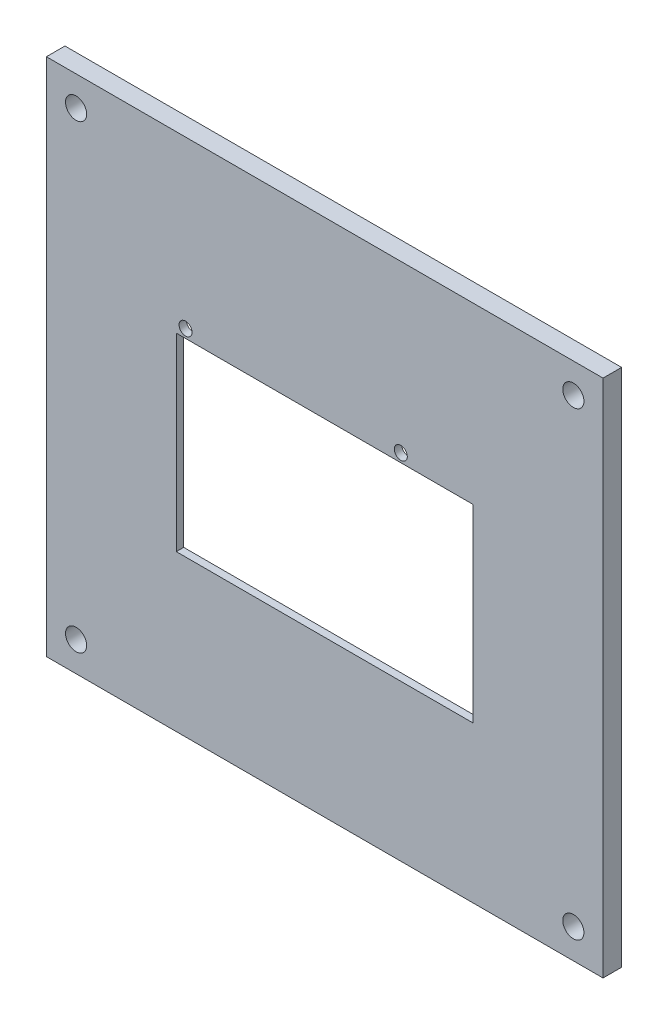
ISO-10303-21;
HEADER;
FILE_DESCRIPTION(('STEP AP214'),'2;1');
FILE_NAME('part.step','',(''),(''),'','','');
FILE_SCHEMA(('AUTOMOTIVE_DESIGN { 1 0 10303 214 1 1 1 1 }'));
ENDSEC;
DATA;
#1=APPLICATION_CONTEXT('core data for automotive mechanical design processes');
#2=APPLICATION_PROTOCOL_DEFINITION('international standard','automotive_design',2000,#1);
#3=PRODUCT_CONTEXT('',#1,'mechanical');
#4=PRODUCT('Part','Part','',(#3));
#5=PRODUCT_RELATED_PRODUCT_CATEGORY('part','',(#4));
#6=PRODUCT_DEFINITION_FORMATION('','',#4);
#7=PRODUCT_DEFINITION_CONTEXT('part definition',#1,'design');
#8=PRODUCT_DEFINITION('design','',#6,#7);
#9=PRODUCT_DEFINITION_SHAPE('','',#8);
#10=(LENGTH_UNIT() NAMED_UNIT(*) SI_UNIT(.MILLI.,.METRE.));
#11=(NAMED_UNIT(*) PLANE_ANGLE_UNIT() SI_UNIT($,.RADIAN.));
#12=(NAMED_UNIT(*) SI_UNIT($,.STERADIAN.) SOLID_ANGLE_UNIT());
#13=UNCERTAINTY_MEASURE_WITH_UNIT(LENGTH_MEASURE(1.E-05),#10,'distance_accuracy_value','');
#14=(GEOMETRIC_REPRESENTATION_CONTEXT(3) GLOBAL_UNCERTAINTY_ASSIGNED_CONTEXT((#13)) GLOBAL_UNIT_ASSIGNED_CONTEXT((#10,
#11,#12)) REPRESENTATION_CONTEXT('',''));
#15=CARTESIAN_POINT('',(0.,0.,0.));
#16=DIRECTION('',(0.,0.,1.));
#17=DIRECTION('',(1.,0.,0.));
#18=AXIS2_PLACEMENT_3D('',#15,#16,#17);
#19=CARTESIAN_POINT('',(0.,0.,5.));
#20=DIRECTION('',(0.,0.,1.));
#21=DIRECTION('',(1.,0.,0.));
#22=AXIS2_PLACEMENT_3D('',#19,#20,#21);
#23=PLANE('',#22);
#24=CARTESIAN_POINT('',(-34.421568627451,13.9638224034432,5.));
#25=DIRECTION('',(0.,0.,1.));
#26=DIRECTION('',(1.,0.,0.));
#27=AXIS2_PLACEMENT_3D('',#24,#25,#26);
#28=CIRCLE('',#27,1.75);
#29=CARTESIAN_POINT('',(-32.671568627451,13.9638224034432,5.));
#30=VERTEX_POINT('',#29);
#31=EDGE_CURVE('E331',#30,#30,#28,.T.);
#32=ORIENTED_EDGE('',*,*,#31,.F.);
#33=EDGE_LOOP('',(#32));
#34=FACE_BOUND('',#33,.T.);
#35=CARTESIAN_POINT('',(-63.921568627451,50.6638224034432,5.));
#36=DIRECTION('',(0.,0.,1.));
#37=DIRECTION('',(1.,0.,0.));
#38=AXIS2_PLACEMENT_3D('',#35,#36,#37);
#39=CIRCLE('',#38,2.84999999999999);
#40=CARTESIAN_POINT('',(-61.071568627451,50.6638224034432,5.));
#41=VERTEX_POINT('',#40);
#42=EDGE_CURVE('E157',#41,#41,#39,.T.);
#43=ORIENTED_EDGE('',*,*,#42,.F.);
#44=EDGE_LOOP('',(#43));
#45=FACE_BOUND('',#44,.T.);
#46=CARTESIAN_POINT('',(70.078431372549,-73.3361775965568,5.));
#47=DIRECTION('',(0.,0.,1.));
#48=DIRECTION('',(1.,0.,0.));
#49=AXIS2_PLACEMENT_3D('',#46,#47,#48);
#50=CIRCLE('',#49,2.85);
#51=CARTESIAN_POINT('',(72.928431372549,-73.3361775965568,5.));
#52=VERTEX_POINT('',#51);
#53=EDGE_CURVE('E169',#52,#52,#50,.T.);
#54=ORIENTED_EDGE('',*,*,#53,.F.);
#55=EDGE_LOOP('',(#54));
#56=FACE_BOUND('',#55,.T.);
#57=DIRECTION('',(0.,-1.,0.));
#58=VECTOR('',#57,1.);
#59=CARTESIAN_POINT('',(-71.921568627451,58.6638224034433,5.));
#60=LINE('',#59,#58);
#61=CARTESIAN_POINT('',(-71.921568627451,58.6638224034433,5.));
#62=VERTEX_POINT('',#61);
#63=CARTESIAN_POINT('',(-71.921568627451,-81.3361775965568,5.));
#64=VERTEX_POINT('',#63);
#65=EDGE_CURVE('E175',#62,#64,#60,.T.);
#66=ORIENTED_EDGE('',*,*,#65,.T.);
#67=DIRECTION('',(1.,0.,0.));
#68=VECTOR('',#67,1.);
#69=CARTESIAN_POINT('',(-71.921568627451,-81.3361775965568,5.));
#70=LINE('',#69,#68);
#71=CARTESIAN_POINT('',(78.078431372549,-81.3361775965568,5.));
#72=VERTEX_POINT('',#71);
#73=EDGE_CURVE('E178',#64,#72,#70,.T.);
#74=ORIENTED_EDGE('',*,*,#73,.T.);
#75=DIRECTION('',(0.,1.,0.));
#76=VECTOR('',#75,1.);
#77=CARTESIAN_POINT('',(78.078431372549,58.6638224034433,5.));
#78=LINE('',#77,#76);
#79=CARTESIAN_POINT('',(78.078431372549,58.6638224034433,5.));
#80=VERTEX_POINT('',#79);
#81=EDGE_CURVE('E181',#72,#80,#78,.T.);
#82=ORIENTED_EDGE('',*,*,#81,.T.);
#83=DIRECTION('',(-1.,0.,0.));
#84=VECTOR('',#83,1.);
#85=CARTESIAN_POINT('',(-71.921568627451,58.6638224034433,5.));
#86=LINE('',#85,#84);
#87=EDGE_CURVE('E183',#80,#62,#86,.T.);
#88=ORIENTED_EDGE('',*,*,#87,.T.);
#89=EDGE_LOOP('',(#66,#74,#82,#88));
#90=FACE_BOUND('',#89,.T.);
#91=CARTESIAN_POINT('',(-63.921568627451,-73.3361775965568,5.));
#92=DIRECTION('',(0.,0.,1.));
#93=DIRECTION('',(1.,0.,0.));
#94=AXIS2_PLACEMENT_3D('',#91,#92,#93);
#95=CIRCLE('',#94,2.85);
#96=CARTESIAN_POINT('',(-61.071568627451,-73.3361775965568,5.));
#97=VERTEX_POINT('',#96);
#98=EDGE_CURVE('E163',#97,#97,#95,.T.);
#99=ORIENTED_EDGE('',*,*,#98,.F.);
#100=EDGE_LOOP('',(#99));
#101=FACE_BOUND('',#100,.T.);
#102=CARTESIAN_POINT('',(70.078431372549,50.6638224034433,5.));
#103=DIRECTION('',(0.,0.,1.));
#104=DIRECTION('',(1.,0.,0.));
#105=AXIS2_PLACEMENT_3D('',#102,#103,#104);
#106=CIRCLE('',#105,2.85);
#107=CARTESIAN_POINT('',(72.928431372549,50.6638224034433,5.));
#108=VERTEX_POINT('',#107);
#109=EDGE_CURVE('E148',#108,#108,#106,.T.);
#110=ORIENTED_EDGE('',*,*,#109,.F.);
#111=EDGE_LOOP('',(#110));
#112=FACE_BOUND('',#111,.T.);
#113=DIRECTION('',(1.,0.,0.));
#114=VECTOR('',#113,1.);
#115=CARTESIAN_POINT('',(-36.921568627451,-39.3361775965568,5.));
#116=LINE('',#115,#114);
#117=CARTESIAN_POINT('',(-36.921568627451,-39.3361775965568,5.));
#118=VERTEX_POINT('',#117);
#119=CARTESIAN_POINT('',(43.078431372549,-39.3361775965568,5.));
#120=VERTEX_POINT('',#119);
#121=EDGE_CURVE('E335',#118,#120,#116,.T.);
#122=ORIENTED_EDGE('',*,*,#121,.F.);
#123=DIRECTION('',(0.,-1.,0.));
#124=VECTOR('',#123,1.);
#125=CARTESIAN_POINT('',(-36.921568627451,11.6638224034432,5.));
#126=LINE('',#125,#124);
#127=CARTESIAN_POINT('',(-36.921568627451,11.6638224034432,5.));
#128=VERTEX_POINT('',#127);
#129=EDGE_CURVE('E144',#128,#118,#126,.T.);
#130=ORIENTED_EDGE('',*,*,#129,.F.);
#131=DIRECTION('',(-1.,0.,0.));
#132=VECTOR('',#131,1.);
#133=CARTESIAN_POINT('',(-36.921568627451,11.6638224034432,5.));
#134=LINE('',#133,#132);
#135=CARTESIAN_POINT('',(43.078431372549,11.6638224034432,5.));
#136=VERTEX_POINT('',#135);
#137=EDGE_CURVE('E340',#136,#128,#134,.T.);
#138=ORIENTED_EDGE('',*,*,#137,.F.);
#139=DIRECTION('',(0.,1.,0.));
#140=VECTOR('',#139,1.);
#141=CARTESIAN_POINT('',(43.078431372549,11.6638224034432,5.));
#142=LINE('',#141,#140);
#143=EDGE_CURVE('E337',#120,#136,#142,.T.);
#144=ORIENTED_EDGE('',*,*,#143,.F.);
#145=EDGE_LOOP('',(#122,#130,#138,#144));
#146=FACE_BOUND('',#145,.T.);
#147=CARTESIAN_POINT('',(23.578431372549,13.9638224034432,5.));
#148=DIRECTION('',(0.,0.,1.));
#149=DIRECTION('',(1.,0.,0.));
#150=AXIS2_PLACEMENT_3D('',#147,#148,#149);
#151=CIRCLE('',#150,1.75);
#152=CARTESIAN_POINT('',(25.328431372549,13.9638224034432,5.));
#153=VERTEX_POINT('',#152);
#154=EDGE_CURVE('E313',#153,#153,#151,.T.);
#155=ORIENTED_EDGE('',*,*,#154,.F.);
#156=EDGE_LOOP('',(#155));
#157=FACE_BOUND('',#156,.T.);
#158=ADVANCED_FACE('F34',(#34,#45,#56,#90,#101,#112,#146,#157),#23,.T.);
#159=CARTESIAN_POINT('',(0.,0.,0.));
#160=DIRECTION('',(0.,0.,1.));
#161=DIRECTION('',(1.,0.,0.));
#162=AXIS2_PLACEMENT_3D('',#159,#160,#161);
#163=PLANE('',#162);
#164=DIRECTION('',(0.,-1.,0.));
#165=VECTOR('',#164,1.);
#166=CARTESIAN_POINT('',(53.078431372549,-49.3361775965568,0.));
#167=LINE('',#166,#165);
#168=CARTESIAN_POINT('',(53.078431372549,21.6638224034432,0.));
#169=VERTEX_POINT('',#168);
#170=CARTESIAN_POINT('',(53.078431372549,-49.3361775965568,0.));
#171=VERTEX_POINT('',#170);
#172=EDGE_CURVE('E361',#169,#171,#167,.T.);
#173=ORIENTED_EDGE('',*,*,#172,.F.);
#174=DIRECTION('',(1.,0.,0.));
#175=VECTOR('',#174,1.);
#176=CARTESIAN_POINT('',(53.078431372549,21.6638224034432,0.));
#177=LINE('',#176,#175);
#178=CARTESIAN_POINT('',(-46.921568627451,21.6638224034432,0.));
#179=VERTEX_POINT('',#178);
#180=EDGE_CURVE('E50',#179,#169,#177,.T.);
#181=ORIENTED_EDGE('',*,*,#180,.F.);
#182=DIRECTION('',(0.,1.,0.));
#183=VECTOR('',#182,1.);
#184=CARTESIAN_POINT('',(-46.921568627451,21.6638224034432,0.));
#185=LINE('',#184,#183);
#186=CARTESIAN_POINT('',(-46.921568627451,-49.3361775965568,0.));
#187=VERTEX_POINT('',#186);
#188=EDGE_CURVE('E322',#187,#179,#185,.T.);
#189=ORIENTED_EDGE('',*,*,#188,.F.);
#190=DIRECTION('',(-1.,0.,0.));
#191=VECTOR('',#190,1.);
#192=CARTESIAN_POINT('',(-46.921568627451,-49.3361775965568,0.));
#193=LINE('',#192,#191);
#194=EDGE_CURVE('E363',#171,#187,#193,.T.);
#195=ORIENTED_EDGE('',*,*,#194,.F.);
#196=EDGE_LOOP('',(#173,#181,#189,#195));
#197=FACE_BOUND('',#196,.T.);
#198=CARTESIAN_POINT('',(70.078431372549,50.6638224034433,0.));
#199=DIRECTION('',(0.,0.,1.));
#200=DIRECTION('',(1.,0.,0.));
#201=AXIS2_PLACEMENT_3D('',#198,#199,#200);
#202=CIRCLE('',#201,2.85);
#203=CARTESIAN_POINT('',(72.928431372549,50.6638224034433,0.));
#204=VERTEX_POINT('',#203);
#205=EDGE_CURVE('E145',#204,#204,#202,.T.);
#206=ORIENTED_EDGE('',*,*,#205,.T.);
#207=EDGE_LOOP('',(#206));
#208=FACE_BOUND('',#207,.T.);
#209=CARTESIAN_POINT('',(-63.921568627451,50.6638224034432,0.));
#210=DIRECTION('',(0.,0.,1.));
#211=DIRECTION('',(1.,0.,0.));
#212=AXIS2_PLACEMENT_3D('',#209,#210,#211);
#213=CIRCLE('',#212,2.84999999999999);
#214=CARTESIAN_POINT('',(-61.071568627451,50.6638224034432,0.));
#215=VERTEX_POINT('',#214);
#216=EDGE_CURVE('E155',#215,#215,#213,.T.);
#217=ORIENTED_EDGE('',*,*,#216,.T.);
#218=EDGE_LOOP('',(#217));
#219=FACE_BOUND('',#218,.T.);
#220=CARTESIAN_POINT('',(-63.921568627451,-73.3361775965568,0.));
#221=DIRECTION('',(0.,0.,1.));
#222=DIRECTION('',(1.,0.,0.));
#223=AXIS2_PLACEMENT_3D('',#220,#221,#222);
#224=CIRCLE('',#223,2.85);
#225=CARTESIAN_POINT('',(-61.071568627451,-73.3361775965568,0.));
#226=VERTEX_POINT('',#225);
#227=EDGE_CURVE('E160',#226,#226,#224,.T.);
#228=ORIENTED_EDGE('',*,*,#227,.T.);
#229=EDGE_LOOP('',(#228));
#230=FACE_BOUND('',#229,.T.);
#231=CARTESIAN_POINT('',(70.078431372549,-73.3361775965568,0.));
#232=DIRECTION('',(0.,0.,1.));
#233=DIRECTION('',(1.,0.,0.));
#234=AXIS2_PLACEMENT_3D('',#231,#232,#233);
#235=CIRCLE('',#234,2.85);
#236=CARTESIAN_POINT('',(72.928431372549,-73.3361775965568,0.));
#237=VERTEX_POINT('',#236);
#238=EDGE_CURVE('E166',#237,#237,#235,.T.);
#239=ORIENTED_EDGE('',*,*,#238,.T.);
#240=EDGE_LOOP('',(#239));
#241=FACE_BOUND('',#240,.T.);
#242=DIRECTION('',(0.,-1.,0.));
#243=VECTOR('',#242,1.);
#244=CARTESIAN_POINT('',(-71.921568627451,58.6638224034433,0.));
#245=LINE('',#244,#243);
#246=CARTESIAN_POINT('',(-71.921568627451,58.6638224034433,0.));
#247=VERTEX_POINT('',#246);
#248=CARTESIAN_POINT('',(-71.921568627451,-81.3361775965568,0.));
#249=VERTEX_POINT('',#248);
#250=EDGE_CURVE('E172',#247,#249,#245,.T.);
#251=ORIENTED_EDGE('',*,*,#250,.F.);
#252=DIRECTION('',(-1.,0.,0.));
#253=VECTOR('',#252,1.);
#254=CARTESIAN_POINT('',(-71.921568627451,58.6638224034433,0.));
#255=LINE('',#254,#253);
#256=CARTESIAN_POINT('',(78.078431372549,58.6638224034433,0.));
#257=VERTEX_POINT('',#256);
#258=EDGE_CURVE('E179',#257,#247,#255,.T.);
#259=ORIENTED_EDGE('',*,*,#258,.F.);
#260=DIRECTION('',(0.,1.,0.));
#261=VECTOR('',#260,1.);
#262=CARTESIAN_POINT('',(78.078431372549,58.6638224034433,0.));
#263=LINE('',#262,#261);
#264=CARTESIAN_POINT('',(78.078431372549,-81.3361775965568,0.));
#265=VERTEX_POINT('',#264);
#266=EDGE_CURVE('E190',#265,#257,#263,.T.);
#267=ORIENTED_EDGE('',*,*,#266,.F.);
#268=DIRECTION('',(1.,0.,0.));
#269=VECTOR('',#268,1.);
#270=CARTESIAN_POINT('',(-71.921568627451,-81.3361775965568,0.));
#271=LINE('',#270,#269);
#272=EDGE_CURVE('E188',#249,#265,#271,.T.);
#273=ORIENTED_EDGE('',*,*,#272,.F.);
#274=EDGE_LOOP('',(#251,#259,#267,#273));
#275=FACE_BOUND('',#274,.T.);
#276=ADVANCED_FACE('F209',(#197,#208,#219,#230,#241,#275),#163,.F.);
#277=CARTESIAN_POINT('',(-71.921568627451,58.6638224034433,5.));
#278=DIRECTION('',(1.,0.,0.));
#279=DIRECTION('',(0.,1.,0.));
#280=AXIS2_PLACEMENT_3D('',#277,#278,#279);
#281=PLANE('',#280);
#282=ORIENTED_EDGE('',*,*,#250,.T.);
#283=DIRECTION('',(0.,0.,-1.));
#284=VECTOR('',#283,1.);
#285=CARTESIAN_POINT('',(-71.921568627451,-81.3361775965568,5.));
#286=LINE('',#285,#284);
#287=EDGE_CURVE('E11',#64,#249,#286,.T.);
#288=ORIENTED_EDGE('',*,*,#287,.F.);
#289=ORIENTED_EDGE('',*,*,#65,.F.);
#290=DIRECTION('',(0.,0.,-1.));
#291=VECTOR('',#290,1.);
#292=CARTESIAN_POINT('',(-71.921568627451,58.6638224034433,5.));
#293=LINE('',#292,#291);
#294=EDGE_CURVE('E185',#62,#247,#293,.T.);
#295=ORIENTED_EDGE('',*,*,#294,.T.);
#296=EDGE_LOOP('',(#282,#288,#289,#295));
#297=FACE_BOUND('',#296,.T.);
#298=ADVANCED_FACE('F36',(#297),#281,.F.);
#299=CARTESIAN_POINT('',(-71.921568627451,-81.3361775965568,5.));
#300=DIRECTION('',(0.,1.,0.));
#301=DIRECTION('',(0.,0.,1.));
#302=AXIS2_PLACEMENT_3D('',#299,#300,#301);
#303=PLANE('',#302);
#304=ORIENTED_EDGE('',*,*,#272,.T.);
#305=DIRECTION('',(0.,0.,-1.));
#306=VECTOR('',#305,1.);
#307=CARTESIAN_POINT('',(78.078431372549,-81.3361775965568,5.));
#308=LINE('',#307,#306);
#309=EDGE_CURVE('E43',#72,#265,#308,.T.);
#310=ORIENTED_EDGE('',*,*,#309,.F.);
#311=ORIENTED_EDGE('',*,*,#73,.F.);
#312=ORIENTED_EDGE('',*,*,#287,.T.);
#313=EDGE_LOOP('',(#304,#310,#311,#312));
#314=FACE_BOUND('',#313,.T.);
#315=ADVANCED_FACE('F219',(#314),#303,.F.);
#316=CARTESIAN_POINT('',(78.078431372549,58.6638224034433,5.));
#317=DIRECTION('',(-1.,0.,0.));
#318=DIRECTION('',(0.,-1.,0.));
#319=AXIS2_PLACEMENT_3D('',#316,#317,#318);
#320=PLANE('',#319);
#321=ORIENTED_EDGE('',*,*,#266,.T.);
#322=DIRECTION('',(0.,0.,-1.));
#323=VECTOR('',#322,1.);
#324=CARTESIAN_POINT('',(78.078431372549,58.6638224034433,5.));
#325=LINE('',#324,#323);
#326=EDGE_CURVE('E195',#80,#257,#325,.T.);
#327=ORIENTED_EDGE('',*,*,#326,.F.);
#328=ORIENTED_EDGE('',*,*,#81,.F.);
#329=ORIENTED_EDGE('',*,*,#309,.T.);
#330=EDGE_LOOP('',(#321,#327,#328,#329));
#331=FACE_BOUND('',#330,.T.);
#332=ADVANCED_FACE('F203',(#331),#320,.F.);
#333=CARTESIAN_POINT('',(-71.921568627451,58.6638224034433,5.));
#334=DIRECTION('',(0.,-1.,0.));
#335=DIRECTION('',(0.,0.,-1.));
#336=AXIS2_PLACEMENT_3D('',#333,#334,#335);
#337=PLANE('',#336);
#338=ORIENTED_EDGE('',*,*,#258,.T.);
#339=ORIENTED_EDGE('',*,*,#294,.F.);
#340=ORIENTED_EDGE('',*,*,#87,.F.);
#341=ORIENTED_EDGE('',*,*,#326,.T.);
#342=EDGE_LOOP('',(#338,#339,#340,#341));
#343=FACE_BOUND('',#342,.T.);
#344=ADVANCED_FACE('F212',(#343),#337,.F.);
#345=CARTESIAN_POINT('',(70.078431372549,-73.3361775965568,5.));
#346=DIRECTION('',(0.,0.,-1.));
#347=DIRECTION('',(-1.,0.,0.));
#348=AXIS2_PLACEMENT_3D('',#345,#346,#347);
#349=CYLINDRICAL_SURFACE('',#348,2.85);
#350=ORIENTED_EDGE('',*,*,#53,.T.);
#351=EDGE_LOOP('',(#350));
#352=FACE_BOUND('',#351,.T.);
#353=ORIENTED_EDGE('',*,*,#238,.F.);
#354=EDGE_LOOP('',(#353));
#355=FACE_BOUND('',#354,.T.);
#356=ADVANCED_FACE('F237',(#352,#355),#349,.F.);
#357=CARTESIAN_POINT('',(-63.921568627451,-73.3361775965568,5.));
#358=DIRECTION('',(0.,0.,-1.));
#359=DIRECTION('',(-1.,0.,0.));
#360=AXIS2_PLACEMENT_3D('',#357,#358,#359);
#361=CYLINDRICAL_SURFACE('',#360,2.85);
#362=ORIENTED_EDGE('',*,*,#98,.T.);
#363=EDGE_LOOP('',(#362));
#364=FACE_BOUND('',#363,.T.);
#365=ORIENTED_EDGE('',*,*,#227,.F.);
#366=EDGE_LOOP('',(#365));
#367=FACE_BOUND('',#366,.T.);
#368=ADVANCED_FACE('F244',(#364,#367),#361,.F.);
#369=CARTESIAN_POINT('',(-63.921568627451,50.6638224034432,5.));
#370=DIRECTION('',(0.,0.,-1.));
#371=DIRECTION('',(-1.,0.,0.));
#372=AXIS2_PLACEMENT_3D('',#369,#370,#371);
#373=CYLINDRICAL_SURFACE('',#372,2.84999999999999);
#374=ORIENTED_EDGE('',*,*,#42,.T.);
#375=EDGE_LOOP('',(#374));
#376=FACE_BOUND('',#375,.T.);
#377=ORIENTED_EDGE('',*,*,#216,.F.);
#378=EDGE_LOOP('',(#377));
#379=FACE_BOUND('',#378,.T.);
#380=ADVANCED_FACE('F249',(#376,#379),#373,.F.);
#381=CARTESIAN_POINT('',(70.078431372549,50.6638224034433,5.));
#382=DIRECTION('',(0.,0.,-1.));
#383=DIRECTION('',(-1.,0.,0.));
#384=AXIS2_PLACEMENT_3D('',#381,#382,#383);
#385=CYLINDRICAL_SURFACE('',#384,2.85);
#386=ORIENTED_EDGE('',*,*,#109,.T.);
#387=EDGE_LOOP('',(#386));
#388=FACE_BOUND('',#387,.T.);
#389=ORIENTED_EDGE('',*,*,#205,.F.);
#390=EDGE_LOOP('',(#389));
#391=FACE_BOUND('',#390,.T.);
#392=ADVANCED_FACE('F259',(#388,#391),#385,.F.);
#393=CARTESIAN_POINT('',(-36.921568627451,11.6638224034432,5.));
#394=DIRECTION('',(1.,0.,0.));
#395=DIRECTION('',(0.,1.,0.));
#396=AXIS2_PLACEMENT_3D('',#393,#394,#395);
#397=PLANE('',#396);
#398=DIRECTION('',(0.,1.,0.));
#399=VECTOR('',#398,1.);
#400=CARTESIAN_POINT('',(-36.921568627451,11.6638224034432,3.));
#401=LINE('',#400,#399);
#402=CARTESIAN_POINT('',(-36.921568627451,-39.3361775965568,3.));
#403=VERTEX_POINT('',#402);
#404=CARTESIAN_POINT('',(-36.921568627451,11.6638224034432,3.));
#405=VERTEX_POINT('',#404);
#406=EDGE_CURVE('E122',#403,#405,#401,.T.);
#407=ORIENTED_EDGE('',*,*,#406,.T.);
#408=DIRECTION('',(0.,0.,-1.));
#409=VECTOR('',#408,1.);
#410=CARTESIAN_POINT('',(-36.921568627451,11.6638224034432,5.));
#411=LINE('',#410,#409);
#412=EDGE_CURVE('E342',#128,#405,#411,.T.);
#413=ORIENTED_EDGE('',*,*,#412,.F.);
#414=ORIENTED_EDGE('',*,*,#129,.T.);
#415=DIRECTION('',(0.,0.,-1.));
#416=VECTOR('',#415,1.);
#417=CARTESIAN_POINT('',(-36.921568627451,-39.3361775965568,5.));
#418=LINE('',#417,#416);
#419=EDGE_CURVE('E137',#118,#403,#418,.T.);
#420=ORIENTED_EDGE('',*,*,#419,.T.);
#421=EDGE_LOOP('',(#407,#413,#414,#420));
#422=FACE_BOUND('',#421,.T.);
#423=ADVANCED_FACE('F142',(#422),#397,.T.);
#424=CARTESIAN_POINT('',(-36.921568627451,-39.3361775965568,5.));
#425=DIRECTION('',(0.,1.,0.));
#426=DIRECTION('',(0.,0.,1.));
#427=AXIS2_PLACEMENT_3D('',#424,#425,#426);
#428=PLANE('',#427);
#429=DIRECTION('',(-1.,0.,0.));
#430=VECTOR('',#429,1.);
#431=CARTESIAN_POINT('',(-36.921568627451,-39.3361775965568,3.));
#432=LINE('',#431,#430);
#433=CARTESIAN_POINT('',(43.078431372549,-39.3361775965568,3.));
#434=VERTEX_POINT('',#433);
#435=EDGE_CURVE('E126',#434,#403,#432,.T.);
#436=ORIENTED_EDGE('',*,*,#435,.T.);
#437=ORIENTED_EDGE('',*,*,#419,.F.);
#438=ORIENTED_EDGE('',*,*,#121,.T.);
#439=DIRECTION('',(0.,0.,-1.));
#440=VECTOR('',#439,1.);
#441=CARTESIAN_POINT('',(43.078431372549,-39.3361775965568,5.));
#442=LINE('',#441,#440);
#443=EDGE_CURVE('E140',#120,#434,#442,.T.);
#444=ORIENTED_EDGE('',*,*,#443,.T.);
#445=EDGE_LOOP('',(#436,#437,#438,#444));
#446=FACE_BOUND('',#445,.T.);
#447=ADVANCED_FACE('F136',(#446),#428,.T.);
#448=CARTESIAN_POINT('',(43.078431372549,11.6638224034432,5.));
#449=DIRECTION('',(-1.,0.,0.));
#450=DIRECTION('',(0.,-1.,0.));
#451=AXIS2_PLACEMENT_3D('',#448,#449,#450);
#452=PLANE('',#451);
#453=DIRECTION('',(0.,-1.,0.));
#454=VECTOR('',#453,1.);
#455=CARTESIAN_POINT('',(43.078431372549,-39.3361775965568,3.));
#456=LINE('',#455,#454);
#457=CARTESIAN_POINT('',(43.078431372549,11.6638224034432,3.));
#458=VERTEX_POINT('',#457);
#459=EDGE_CURVE('E58',#458,#434,#456,.T.);
#460=ORIENTED_EDGE('',*,*,#459,.T.);
#461=ORIENTED_EDGE('',*,*,#443,.F.);
#462=ORIENTED_EDGE('',*,*,#143,.T.);
#463=DIRECTION('',(0.,0.,-1.));
#464=VECTOR('',#463,1.);
#465=CARTESIAN_POINT('',(43.078431372549,11.6638224034432,5.));
#466=LINE('',#465,#464);
#467=EDGE_CURVE('E150',#136,#458,#466,.T.);
#468=ORIENTED_EDGE('',*,*,#467,.T.);
#469=EDGE_LOOP('',(#460,#461,#462,#468));
#470=FACE_BOUND('',#469,.T.);
#471=ADVANCED_FACE('F271',(#470),#452,.T.);
#472=CARTESIAN_POINT('',(-36.921568627451,11.6638224034432,5.));
#473=DIRECTION('',(0.,-1.,0.));
#474=DIRECTION('',(0.,0.,-1.));
#475=AXIS2_PLACEMENT_3D('',#472,#473,#474);
#476=PLANE('',#475);
#477=DIRECTION('',(1.,0.,0.));
#478=VECTOR('',#477,1.);
#479=CARTESIAN_POINT('',(43.078431372549,11.6638224034432,3.));
#480=LINE('',#479,#478);
#481=EDGE_CURVE('E127',#405,#458,#480,.T.);
#482=ORIENTED_EDGE('',*,*,#481,.T.);
#483=ORIENTED_EDGE('',*,*,#467,.F.);
#484=ORIENTED_EDGE('',*,*,#137,.T.);
#485=ORIENTED_EDGE('',*,*,#412,.T.);
#486=EDGE_LOOP('',(#482,#483,#484,#485));
#487=FACE_BOUND('',#486,.T.);
#488=ADVANCED_FACE('F274',(#487),#476,.T.);
#489=CARTESIAN_POINT('',(-34.421568627451,13.9638224034432,5.));
#490=DIRECTION('',(0.,0.,-1.));
#491=DIRECTION('',(-1.,0.,0.));
#492=AXIS2_PLACEMENT_3D('',#489,#490,#491);
#493=CYLINDRICAL_SURFACE('',#492,1.75);
#494=CARTESIAN_POINT('',(-34.421568627451,13.9638224034432,3.));
#495=DIRECTION('',(0.,0.,1.));
#496=DIRECTION('',(1.,0.,0.));
#497=AXIS2_PLACEMENT_3D('',#494,#495,#496);
#498=CIRCLE('',#497,1.75);
#499=CARTESIAN_POINT('',(-32.671568627451,13.9638224034432,3.));
#500=VERTEX_POINT('',#499);
#501=EDGE_CURVE('E309',#500,#500,#498,.T.);
#502=ORIENTED_EDGE('',*,*,#501,.F.);
#503=EDGE_LOOP('',(#502));
#504=FACE_BOUND('',#503,.T.);
#505=ORIENTED_EDGE('',*,*,#31,.T.);
#506=EDGE_LOOP('',(#505));
#507=FACE_BOUND('',#506,.T.);
#508=ADVANCED_FACE('F278',(#504,#507),#493,.F.);
#509=CARTESIAN_POINT('',(23.578431372549,13.9638224034432,5.));
#510=DIRECTION('',(0.,0.,-1.));
#511=DIRECTION('',(-1.,0.,0.));
#512=AXIS2_PLACEMENT_3D('',#509,#510,#511);
#513=CYLINDRICAL_SURFACE('',#512,1.75);
#514=CARTESIAN_POINT('',(23.578431372549,13.9638224034432,3.));
#515=DIRECTION('',(0.,0.,1.));
#516=DIRECTION('',(1.,0.,0.));
#517=AXIS2_PLACEMENT_3D('',#514,#515,#516);
#518=CIRCLE('',#517,1.75);
#519=CARTESIAN_POINT('',(25.328431372549,13.9638224034432,3.));
#520=VERTEX_POINT('',#519);
#521=EDGE_CURVE('E38',#520,#520,#518,.T.);
#522=ORIENTED_EDGE('',*,*,#521,.F.);
#523=EDGE_LOOP('',(#522));
#524=FACE_BOUND('',#523,.T.);
#525=ORIENTED_EDGE('',*,*,#154,.T.);
#526=EDGE_LOOP('',(#525));
#527=FACE_BOUND('',#526,.T.);
#528=ADVANCED_FACE('F282',(#524,#527),#513,.F.);
#529=CARTESIAN_POINT('',(53.078431372549,21.6638224034432,3.));
#530=DIRECTION('',(0.,1.,0.));
#531=DIRECTION('',(0.,0.,1.));
#532=AXIS2_PLACEMENT_3D('',#529,#530,#531);
#533=PLANE('',#532);
#534=ORIENTED_EDGE('',*,*,#180,.T.);
#535=DIRECTION('',(0.,0.,-1.));
#536=VECTOR('',#535,1.);
#537=CARTESIAN_POINT('',(53.078431372549,21.6638224034432,3.));
#538=LINE('',#537,#536);
#539=CARTESIAN_POINT('',(53.078431372549,21.6638224034432,3.));
#540=VERTEX_POINT('',#539);
#541=EDGE_CURVE('E326',#540,#169,#538,.T.);
#542=ORIENTED_EDGE('',*,*,#541,.F.);
#543=DIRECTION('',(1.,0.,0.));
#544=VECTOR('',#543,1.);
#545=CARTESIAN_POINT('',(53.078431372549,21.6638224034432,3.));
#546=LINE('',#545,#544);
#547=CARTESIAN_POINT('',(-46.921568627451,21.6638224034432,3.));
#548=VERTEX_POINT('',#547);
#549=EDGE_CURVE('E349',#548,#540,#546,.T.);
#550=ORIENTED_EDGE('',*,*,#549,.F.);
#551=DIRECTION('',(0.,0.,-1.));
#552=VECTOR('',#551,1.);
#553=CARTESIAN_POINT('',(-46.921568627451,21.6638224034432,3.));
#554=LINE('',#553,#552);
#555=EDGE_CURVE('E312',#548,#179,#554,.T.);
#556=ORIENTED_EDGE('',*,*,#555,.T.);
#557=EDGE_LOOP('',(#534,#542,#550,#556));
#558=FACE_BOUND('',#557,.T.);
#559=ADVANCED_FACE('F286',(#558),#533,.F.);
#560=CARTESIAN_POINT('',(-46.921568627451,21.6638224034432,3.));
#561=DIRECTION('',(-1.,0.,0.));
#562=DIRECTION('',(0.,0.,1.));
#563=AXIS2_PLACEMENT_3D('',#560,#561,#562);
#564=PLANE('',#563);
#565=ORIENTED_EDGE('',*,*,#188,.T.);
#566=ORIENTED_EDGE('',*,*,#555,.F.);
#567=DIRECTION('',(0.,1.,0.));
#568=VECTOR('',#567,1.);
#569=CARTESIAN_POINT('',(-46.921568627451,21.6638224034432,3.));
#570=LINE('',#569,#568);
#571=CARTESIAN_POINT('',(-46.921568627451,-49.3361775965568,3.));
#572=VERTEX_POINT('',#571);
#573=EDGE_CURVE('E327',#572,#548,#570,.T.);
#574=ORIENTED_EDGE('',*,*,#573,.F.);
#575=DIRECTION('',(0.,0.,-1.));
#576=VECTOR('',#575,1.);
#577=CARTESIAN_POINT('',(-46.921568627451,-49.3361775965568,3.));
#578=LINE('',#577,#576);
#579=EDGE_CURVE('E315',#572,#187,#578,.T.);
#580=ORIENTED_EDGE('',*,*,#579,.T.);
#581=EDGE_LOOP('',(#565,#566,#574,#580));
#582=FACE_BOUND('',#581,.T.);
#583=ADVANCED_FACE('F290',(#582),#564,.F.);
#584=CARTESIAN_POINT('',(-46.921568627451,-49.3361775965568,3.));
#585=DIRECTION('',(0.,-1.,0.));
#586=DIRECTION('',(0.,0.,-1.));
#587=AXIS2_PLACEMENT_3D('',#584,#585,#586);
#588=PLANE('',#587);
#589=ORIENTED_EDGE('',*,*,#194,.T.);
#590=ORIENTED_EDGE('',*,*,#579,.F.);
#591=DIRECTION('',(-1.,0.,0.));
#592=VECTOR('',#591,1.);
#593=CARTESIAN_POINT('',(-46.921568627451,-49.3361775965568,3.));
#594=LINE('',#593,#592);
#595=CARTESIAN_POINT('',(53.078431372549,-49.3361775965568,3.));
#596=VERTEX_POINT('',#595);
#597=EDGE_CURVE('E355',#596,#572,#594,.T.);
#598=ORIENTED_EDGE('',*,*,#597,.F.);
#599=DIRECTION('',(0.,0.,-1.));
#600=VECTOR('',#599,1.);
#601=CARTESIAN_POINT('',(53.078431372549,-49.3361775965568,3.));
#602=LINE('',#601,#600);
#603=EDGE_CURVE('E319',#596,#171,#602,.T.);
#604=ORIENTED_EDGE('',*,*,#603,.T.);
#605=EDGE_LOOP('',(#589,#590,#598,#604));
#606=FACE_BOUND('',#605,.T.);
#607=ADVANCED_FACE('F294',(#606),#588,.F.);
#608=CARTESIAN_POINT('',(53.078431372549,-49.3361775965568,3.));
#609=DIRECTION('',(1.,0.,0.));
#610=DIRECTION('',(0.,0.,-1.));
#611=AXIS2_PLACEMENT_3D('',#608,#609,#610);
#612=PLANE('',#611);
#613=ORIENTED_EDGE('',*,*,#172,.T.);
#614=ORIENTED_EDGE('',*,*,#603,.F.);
#615=DIRECTION('',(0.,-1.,0.));
#616=VECTOR('',#615,1.);
#617=CARTESIAN_POINT('',(53.078431372549,-49.3361775965568,3.));
#618=LINE('',#617,#616);
#619=EDGE_CURVE('E352',#540,#596,#618,.T.);
#620=ORIENTED_EDGE('',*,*,#619,.F.);
#621=ORIENTED_EDGE('',*,*,#541,.T.);
#622=EDGE_LOOP('',(#613,#614,#620,#621));
#623=FACE_BOUND('',#622,.T.);
#624=ADVANCED_FACE('F291',(#623),#612,.F.);
#625=CARTESIAN_POINT('',(0.,0.,3.));
#626=DIRECTION('',(0.,0.,1.));
#627=DIRECTION('',(1.,0.,0.));
#628=AXIS2_PLACEMENT_3D('',#625,#626,#627);
#629=PLANE('',#628);
#630=ORIENTED_EDGE('',*,*,#501,.T.);
#631=EDGE_LOOP('',(#630));
#632=FACE_BOUND('',#631,.T.);
#633=ORIENTED_EDGE('',*,*,#521,.T.);
#634=EDGE_LOOP('',(#633));
#635=FACE_BOUND('',#634,.T.);
#636=ORIENTED_EDGE('',*,*,#481,.F.);
#637=ORIENTED_EDGE('',*,*,#406,.F.);
#638=ORIENTED_EDGE('',*,*,#435,.F.);
#639=ORIENTED_EDGE('',*,*,#459,.F.);
#640=EDGE_LOOP('',(#636,#637,#638,#639));
#641=FACE_BOUND('',#640,.T.);
#642=ORIENTED_EDGE('',*,*,#549,.T.);
#643=ORIENTED_EDGE('',*,*,#619,.T.);
#644=ORIENTED_EDGE('',*,*,#597,.T.);
#645=ORIENTED_EDGE('',*,*,#573,.T.);
#646=EDGE_LOOP('',(#642,#643,#644,#645));
#647=FACE_BOUND('',#646,.T.);
#648=ADVANCED_FACE('F124',(#632,#635,#641,#647),#629,.F.);
#649=CLOSED_SHELL('',(#158,#276,#298,#315,#332,#344,#356,#368,#380,#392,#423,#447,#471,#488,
#508,#528,#559,#583,#607,#624,#648));
#650=MANIFOLD_SOLID_BREP('B2',#649);
#651=ADVANCED_BREP_SHAPE_REPRESENTATION('',(#18,#650),#14);
#652=SHAPE_DEFINITION_REPRESENTATION(#9,#651);
ENDSEC;
END-ISO-10303-21;
